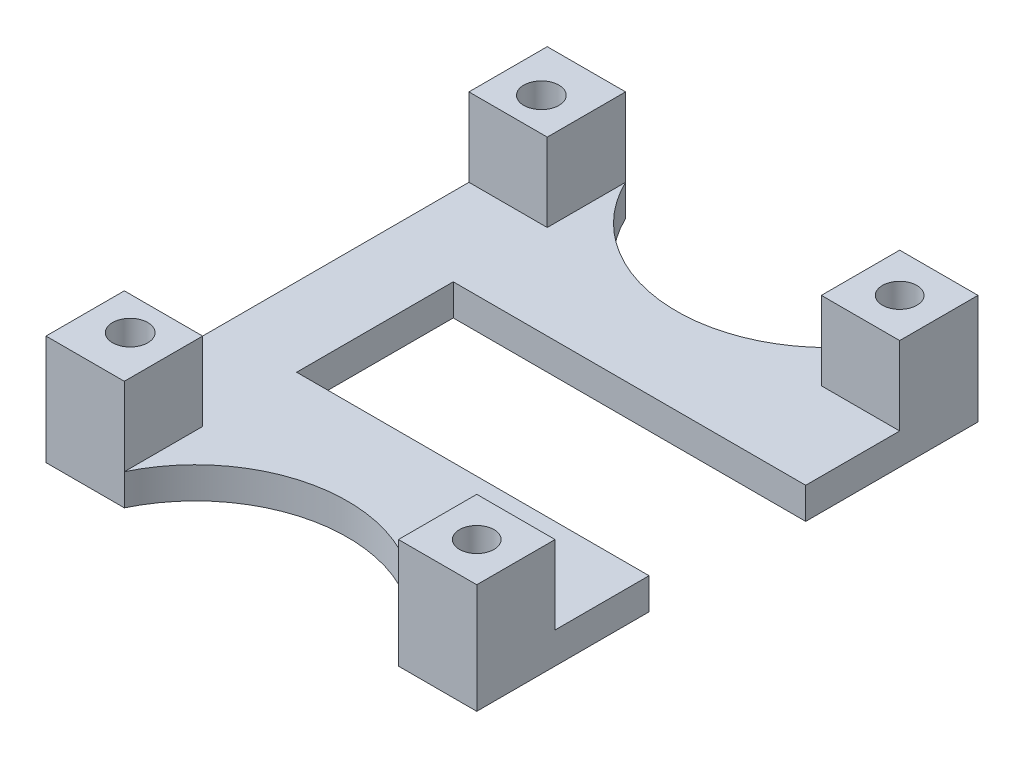
ISO-10303-21;
HEADER;
FILE_DESCRIPTION(('STEP AP214'),'2;1');
FILE_NAME('part.step','',(''),(''),'','','');
FILE_SCHEMA(('AUTOMOTIVE_DESIGN { 1 0 10303 214 1 1 1 1 }'));
ENDSEC;
DATA;
#1=APPLICATION_CONTEXT('core data for automotive mechanical design processes');
#2=APPLICATION_PROTOCOL_DEFINITION('international standard','automotive_design',2000,#1);
#3=PRODUCT_CONTEXT('',#1,'mechanical');
#4=PRODUCT('Part','Part','',(#3));
#5=PRODUCT_RELATED_PRODUCT_CATEGORY('part','',(#4));
#6=PRODUCT_DEFINITION_FORMATION('','',#4);
#7=PRODUCT_DEFINITION_CONTEXT('part definition',#1,'design');
#8=PRODUCT_DEFINITION('design','',#6,#7);
#9=PRODUCT_DEFINITION_SHAPE('','',#8);
#10=(LENGTH_UNIT() NAMED_UNIT(*) SI_UNIT(.MILLI.,.METRE.));
#11=(NAMED_UNIT(*) PLANE_ANGLE_UNIT() SI_UNIT($,.RADIAN.));
#12=(NAMED_UNIT(*) SI_UNIT($,.STERADIAN.) SOLID_ANGLE_UNIT());
#13=UNCERTAINTY_MEASURE_WITH_UNIT(LENGTH_MEASURE(1.E-05),#10,'distance_accuracy_value','');
#14=(GEOMETRIC_REPRESENTATION_CONTEXT(3) GLOBAL_UNCERTAINTY_ASSIGNED_CONTEXT((#13)) GLOBAL_UNIT_ASSIGNED_CONTEXT((#10,
#11,#12)) REPRESENTATION_CONTEXT('',''));
#15=CARTESIAN_POINT('',(0.,0.,0.));
#16=DIRECTION('',(0.,0.,1.));
#17=DIRECTION('',(1.,0.,0.));
#18=AXIS2_PLACEMENT_3D('',#15,#16,#17);
#19=CARTESIAN_POINT('',(50.,4.,-27.));
#20=DIRECTION('',(0.,-1.,0.));
#21=DIRECTION('',(0.,0.,-1.));
#22=AXIS2_PLACEMENT_3D('',#19,#20,#21);
#23=CYLINDRICAL_SURFACE('',#22,2.2);
#24=CARTESIAN_POINT('',(50.,14.,-27.));
#25=DIRECTION('',(0.,1.,0.));
#26=DIRECTION('',(0.,0.,1.));
#27=AXIS2_PLACEMENT_3D('',#24,#25,#26);
#28=CIRCLE('',#27,2.20000000000001);
#29=CARTESIAN_POINT('',(50.,14.,-24.8));
#30=VERTEX_POINT('',#29);
#31=EDGE_CURVE('E381',#30,#30,#28,.T.);
#32=ORIENTED_EDGE('',*,*,#31,.T.);
#33=EDGE_LOOP('',(#32));
#34=FACE_BOUND('',#33,.T.);
#35=CARTESIAN_POINT('',(50.,2.5,-27.));
#36=DIRECTION('',(0.,-1.,0.));
#37=DIRECTION('',(0.,0.,-1.));
#38=AXIS2_PLACEMENT_3D('',#35,#36,#37);
#39=CIRCLE('',#38,2.2);
#40=CARTESIAN_POINT('',(50.,2.5,-29.2));
#41=VERTEX_POINT('',#40);
#42=EDGE_CURVE('E39',#41,#41,#39,.T.);
#43=ORIENTED_EDGE('',*,*,#42,.T.);
#44=EDGE_LOOP('',(#43));
#45=FACE_BOUND('',#44,.T.);
#46=ADVANCED_FACE('F35',(#34,#45),#23,.F.);
#47=CARTESIAN_POINT('',(50.,4.,27.));
#48=DIRECTION('',(0.,-1.,0.));
#49=DIRECTION('',(0.,0.,-1.));
#50=AXIS2_PLACEMENT_3D('',#47,#48,#49);
#51=CYLINDRICAL_SURFACE('',#50,2.2);
#52=CARTESIAN_POINT('',(50.,14.,27.));
#53=DIRECTION('',(0.,1.,0.));
#54=DIRECTION('',(0.,0.,1.));
#55=AXIS2_PLACEMENT_3D('',#52,#53,#54);
#56=CIRCLE('',#55,2.2);
#57=CARTESIAN_POINT('',(50.,14.,29.2));
#58=VERTEX_POINT('',#57);
#59=EDGE_CURVE('E269',#58,#58,#56,.T.);
#60=ORIENTED_EDGE('',*,*,#59,.T.);
#61=EDGE_LOOP('',(#60));
#62=FACE_BOUND('',#61,.T.);
#63=CARTESIAN_POINT('',(50.,2.5,27.));
#64=DIRECTION('',(0.,-1.,0.));
#65=DIRECTION('',(0.,0.,-1.));
#66=AXIS2_PLACEMENT_3D('',#63,#64,#65);
#67=CIRCLE('',#66,2.2);
#68=CARTESIAN_POINT('',(50.,2.5,24.8));
#69=VERTEX_POINT('',#68);
#70=EDGE_CURVE('E375',#69,#69,#67,.T.);
#71=ORIENTED_EDGE('',*,*,#70,.T.);
#72=EDGE_LOOP('',(#71));
#73=FACE_BOUND('',#72,.T.);
#74=ADVANCED_FACE('F491',(#62,#73),#51,.F.);
#75=CARTESIAN_POINT('',(0.,4.,0.));
#76=DIRECTION('',(0.,1.,0.));
#77=DIRECTION('',(0.,0.,1.));
#78=AXIS2_PLACEMENT_3D('',#75,#76,#77);
#79=PLANE('',#78);
#80=DIRECTION('',(0.,0.,-1.));
#81=VECTOR('',#80,1.);
#82=CARTESIAN_POINT('',(55.,4.,0.));
#83=LINE('',#82,#81);
#84=CARTESIAN_POINT('',(55.,4.,-10.));
#85=VERTEX_POINT('',#84);
#86=CARTESIAN_POINT('',(55.,4.,-22.));
#87=VERTEX_POINT('',#86);
#88=EDGE_CURVE('E57',#85,#87,#83,.T.);
#89=ORIENTED_EDGE('',*,*,#88,.T.);
#90=DIRECTION('',(1.,0.,0.));
#91=VECTOR('',#90,1.);
#92=CARTESIAN_POINT('',(45.,4.,-22.));
#93=LINE('',#92,#91);
#94=CARTESIAN_POINT('',(45.,4.,-22.));
#95=VERTEX_POINT('',#94);
#96=EDGE_CURVE('E52',#95,#87,#93,.T.);
#97=ORIENTED_EDGE('',*,*,#96,.F.);
#98=DIRECTION('',(0.,0.,1.));
#99=VECTOR('',#98,1.);
#100=CARTESIAN_POINT('',(45.,4.,-32.));
#101=LINE('',#100,#99);
#102=CARTESIAN_POINT('',(45.,4.,-32.));
#103=VERTEX_POINT('',#102);
#104=EDGE_CURVE('E205',#103,#95,#101,.T.);
#105=ORIENTED_EDGE('',*,*,#104,.F.);
#106=CARTESIAN_POINT('',(27.5,4.,-40.4204545454546));
#107=DIRECTION('',(0.,1.,0.));
#108=DIRECTION('',(0.,0.,1.));
#109=AXIS2_PLACEMENT_3D('',#106,#107,#108);
#110=CIRCLE('',#109,19.4204545454546);
#111=CARTESIAN_POINT('',(10.,4.,-32.));
#112=VERTEX_POINT('',#111);
#113=EDGE_CURVE('E315',#112,#103,#110,.T.);
#114=ORIENTED_EDGE('',*,*,#113,.F.);
#115=DIRECTION('',(0.,0.,-1.));
#116=VECTOR('',#115,1.);
#117=CARTESIAN_POINT('',(10.,4.,-22.));
#118=LINE('',#117,#116);
#119=CARTESIAN_POINT('',(10.,4.,-22.));
#120=VERTEX_POINT('',#119);
#121=EDGE_CURVE('E251',#120,#112,#118,.T.);
#122=ORIENTED_EDGE('',*,*,#121,.F.);
#123=DIRECTION('',(1.,0.,0.));
#124=VECTOR('',#123,1.);
#125=CARTESIAN_POINT('',(0.,4.,-22.));
#126=LINE('',#125,#124);
#127=CARTESIAN_POINT('',(0.,4.,-22.));
#128=VERTEX_POINT('',#127);
#129=EDGE_CURVE('E246',#128,#120,#126,.T.);
#130=ORIENTED_EDGE('',*,*,#129,.F.);
#131=DIRECTION('',(0.,0.,-1.));
#132=VECTOR('',#131,1.);
#133=CARTESIAN_POINT('',(0.,4.,0.));
#134=LINE('',#133,#132);
#135=CARTESIAN_POINT('',(0.,4.,22.));
#136=VERTEX_POINT('',#135);
#137=EDGE_CURVE('E298',#136,#128,#134,.T.);
#138=ORIENTED_EDGE('',*,*,#137,.F.);
#139=DIRECTION('',(-1.,0.,0.));
#140=VECTOR('',#139,1.);
#141=CARTESIAN_POINT('',(10.,4.,22.));
#142=LINE('',#141,#140);
#143=CARTESIAN_POINT('',(10.,4.,22.));
#144=VERTEX_POINT('',#143);
#145=EDGE_CURVE('E223',#144,#136,#142,.T.);
#146=ORIENTED_EDGE('',*,*,#145,.F.);
#147=DIRECTION('',(0.,0.,-1.));
#148=VECTOR('',#147,1.);
#149=CARTESIAN_POINT('',(10.,4.,32.));
#150=LINE('',#149,#148);
#151=CARTESIAN_POINT('',(10.,4.,32.));
#152=VERTEX_POINT('',#151);
#153=EDGE_CURVE('E212',#152,#144,#150,.T.);
#154=ORIENTED_EDGE('',*,*,#153,.F.);
#155=CARTESIAN_POINT('',(27.5,4.,40.4204545454545));
#156=DIRECTION('',(0.,1.,0.));
#157=DIRECTION('',(0.,0.,1.));
#158=AXIS2_PLACEMENT_3D('',#155,#156,#157);
#159=CIRCLE('',#158,19.4204545454545);
#160=CARTESIAN_POINT('',(45.,4.,32.));
#161=VERTEX_POINT('',#160);
#162=EDGE_CURVE('E300',#161,#152,#159,.T.);
#163=ORIENTED_EDGE('',*,*,#162,.F.);
#164=DIRECTION('',(0.,0.,1.));
#165=VECTOR('',#164,1.);
#166=CARTESIAN_POINT('',(45.,4.,32.));
#167=LINE('',#166,#165);
#168=CARTESIAN_POINT('',(45.,4.,22.));
#169=VERTEX_POINT('',#168);
#170=EDGE_CURVE('E272',#169,#161,#167,.T.);
#171=ORIENTED_EDGE('',*,*,#170,.F.);
#172=DIRECTION('',(-1.,0.,0.));
#173=VECTOR('',#172,1.);
#174=CARTESIAN_POINT('',(45.,4.,22.));
#175=LINE('',#174,#173);
#176=CARTESIAN_POINT('',(55.,4.,22.));
#177=VERTEX_POINT('',#176);
#178=EDGE_CURVE('E277',#177,#169,#175,.T.);
#179=ORIENTED_EDGE('',*,*,#178,.F.);
#180=DIRECTION('',(0.,0.,-1.));
#181=VECTOR('',#180,1.);
#182=CARTESIAN_POINT('',(55.,4.,0.));
#183=LINE('',#182,#181);
#184=CARTESIAN_POINT('',(55.,4.,10.));
#185=VERTEX_POINT('',#184);
#186=EDGE_CURVE('E303',#177,#185,#183,.T.);
#187=ORIENTED_EDGE('',*,*,#186,.T.);
#188=DIRECTION('',(1.,0.,0.));
#189=VECTOR('',#188,1.);
#190=CARTESIAN_POINT('',(0.,4.,9.99999999999994));
#191=LINE('',#190,#189);
#192=CARTESIAN_POINT('',(10.,4.,10.));
#193=VERTEX_POINT('',#192);
#194=EDGE_CURVE('E305',#193,#185,#191,.T.);
#195=ORIENTED_EDGE('',*,*,#194,.F.);
#196=DIRECTION('',(0.,0.,1.));
#197=VECTOR('',#196,1.);
#198=CARTESIAN_POINT('',(10.,4.,0.));
#199=LINE('',#198,#197);
#200=CARTESIAN_POINT('',(10.,4.,-9.99999999999999));
#201=VERTEX_POINT('',#200);
#202=EDGE_CURVE('E308',#201,#193,#199,.T.);
#203=ORIENTED_EDGE('',*,*,#202,.F.);
#204=DIRECTION('',(-1.,0.,0.));
#205=VECTOR('',#204,1.);
#206=CARTESIAN_POINT('',(0.,4.,-9.99999999999999));
#207=LINE('',#206,#205);
#208=EDGE_CURVE('E311',#85,#201,#207,.T.);
#209=ORIENTED_EDGE('',*,*,#208,.F.);
#210=EDGE_LOOP('',(#89,#97,#105,#114,#122,#130,#138,#146,#154,#163,#171,#179,#187,#195,#203,#209));
#211=FACE_BOUND('',#210,.T.);
#212=ADVANCED_FACE('F405',(#211),#79,.T.);
#213=CARTESIAN_POINT('',(0.,4.,0.));
#214=DIRECTION('',(-1.,0.,0.));
#215=DIRECTION('',(0.,0.,1.));
#216=AXIS2_PLACEMENT_3D('',#213,#214,#215);
#217=PLANE('',#216);
#218=DIRECTION('',(0.,0.,-1.));
#219=VECTOR('',#218,1.);
#220=CARTESIAN_POINT('',(0.,0.,0.));
#221=LINE('',#220,#219);
#222=CARTESIAN_POINT('',(0.,0.,32.));
#223=VERTEX_POINT('',#222);
#224=CARTESIAN_POINT('',(0.,0.,-32.));
#225=VERTEX_POINT('',#224);
#226=EDGE_CURVE('E297',#223,#225,#221,.T.);
#227=ORIENTED_EDGE('',*,*,#226,.F.);
#228=DIRECTION('',(0.,-1.,0.));
#229=VECTOR('',#228,1.);
#230=CARTESIAN_POINT('',(0.,4.,32.));
#231=LINE('',#230,#229);
#232=CARTESIAN_POINT('',(0.,14.,32.));
#233=VERTEX_POINT('',#232);
#234=EDGE_CURVE('E11',#233,#223,#231,.T.);
#235=ORIENTED_EDGE('',*,*,#234,.F.);
#236=DIRECTION('',(0.,0.,1.));
#237=VECTOR('',#236,1.);
#238=CARTESIAN_POINT('',(0.,14.,22.));
#239=LINE('',#238,#237);
#240=CARTESIAN_POINT('',(0.,14.,22.));
#241=VERTEX_POINT('',#240);
#242=EDGE_CURVE('E225',#241,#233,#239,.T.);
#243=ORIENTED_EDGE('',*,*,#242,.F.);
#244=DIRECTION('',(0.,-1.,0.));
#245=VECTOR('',#244,1.);
#246=CARTESIAN_POINT('',(0.,14.,22.));
#247=LINE('',#246,#245);
#248=EDGE_CURVE('E237',#241,#136,#247,.T.);
#249=ORIENTED_EDGE('',*,*,#248,.T.);
#250=ORIENTED_EDGE('',*,*,#137,.T.);
#251=DIRECTION('',(0.,-1.,0.));
#252=VECTOR('',#251,1.);
#253=CARTESIAN_POINT('',(0.,14.,-22.));
#254=LINE('',#253,#252);
#255=CARTESIAN_POINT('',(0.,14.,-22.));
#256=VERTEX_POINT('',#255);
#257=EDGE_CURVE('E258',#256,#128,#254,.T.);
#258=ORIENTED_EDGE('',*,*,#257,.F.);
#259=DIRECTION('',(0.,0.,1.));
#260=VECTOR('',#259,1.);
#261=CARTESIAN_POINT('',(0.,14.,-32.));
#262=LINE('',#261,#260);
#263=CARTESIAN_POINT('',(0.,14.,-32.));
#264=VERTEX_POINT('',#263);
#265=EDGE_CURVE('E256',#264,#256,#262,.T.);
#266=ORIENTED_EDGE('',*,*,#265,.F.);
#267=DIRECTION('',(0.,-1.,0.));
#268=VECTOR('',#267,1.);
#269=CARTESIAN_POINT('',(0.,4.,-32.));
#270=LINE('',#269,#268);
#271=EDGE_CURVE('E317',#264,#225,#270,.T.);
#272=ORIENTED_EDGE('',*,*,#271,.T.);
#273=EDGE_LOOP('',(#227,#235,#243,#249,#250,#258,#266,#272));
#274=FACE_BOUND('',#273,.T.);
#275=ADVANCED_FACE('F37',(#274),#217,.T.);
#276=CARTESIAN_POINT('',(0.,4.,32.));
#277=DIRECTION('',(0.,0.,-1.));
#278=DIRECTION('',(-1.,0.,0.));
#279=AXIS2_PLACEMENT_3D('',#276,#277,#278);
#280=PLANE('',#279);
#281=DIRECTION('',(1.,0.,0.));
#282=VECTOR('',#281,1.);
#283=CARTESIAN_POINT('',(0.,0.,32.));
#284=LINE('',#283,#282);
#285=CARTESIAN_POINT('',(10.,0.,32.));
#286=VERTEX_POINT('',#285);
#287=EDGE_CURVE('E320',#223,#286,#284,.T.);
#288=ORIENTED_EDGE('',*,*,#287,.T.);
#289=DIRECTION('',(0.,-1.,0.));
#290=VECTOR('',#289,1.);
#291=CARTESIAN_POINT('',(10.,4.,32.));
#292=LINE('',#291,#290);
#293=EDGE_CURVE('E44',#152,#286,#292,.T.);
#294=ORIENTED_EDGE('',*,*,#293,.F.);
#295=DIRECTION('',(0.,-1.,0.));
#296=VECTOR('',#295,1.);
#297=CARTESIAN_POINT('',(10.,14.,32.));
#298=LINE('',#297,#296);
#299=CARTESIAN_POINT('',(10.,14.,32.));
#300=VERTEX_POINT('',#299);
#301=EDGE_CURVE('E230',#300,#152,#298,.T.);
#302=ORIENTED_EDGE('',*,*,#301,.F.);
#303=DIRECTION('',(1.,0.,0.));
#304=VECTOR('',#303,1.);
#305=CARTESIAN_POINT('',(0.,14.,32.));
#306=LINE('',#305,#304);
#307=EDGE_CURVE('E228',#233,#300,#306,.T.);
#308=ORIENTED_EDGE('',*,*,#307,.F.);
#309=ORIENTED_EDGE('',*,*,#234,.T.);
#310=EDGE_LOOP('',(#288,#294,#302,#308,#309));
#311=FACE_BOUND('',#310,.T.);
#312=ADVANCED_FACE('F447',(#311),#280,.F.);
#313=CARTESIAN_POINT('',(27.5,4.,40.4204545454545));
#314=DIRECTION('',(0.,-1.,0.));
#315=DIRECTION('',(0.,0.,-1.));
#316=AXIS2_PLACEMENT_3D('',#313,#314,#315);
#317=CYLINDRICAL_SURFACE('',#316,19.4204545454545);
#318=CARTESIAN_POINT('',(27.5,0.,40.4204545454545));
#319=DIRECTION('',(0.,1.,0.));
#320=DIRECTION('',(0.,0.,1.));
#321=AXIS2_PLACEMENT_3D('',#318,#319,#320);
#322=CIRCLE('',#321,19.4204545454545);
#323=CARTESIAN_POINT('',(45.,0.,32.));
#324=VERTEX_POINT('',#323);
#325=EDGE_CURVE('E323',#324,#286,#322,.T.);
#326=ORIENTED_EDGE('',*,*,#325,.F.);
#327=DIRECTION('',(0.,-1.,0.));
#328=VECTOR('',#327,1.);
#329=CARTESIAN_POINT('',(45.,4.,32.));
#330=LINE('',#329,#328);
#331=EDGE_CURVE('E373',#161,#324,#330,.T.);
#332=ORIENTED_EDGE('',*,*,#331,.F.);
#333=ORIENTED_EDGE('',*,*,#162,.T.);
#334=ORIENTED_EDGE('',*,*,#293,.T.);
#335=EDGE_LOOP('',(#326,#332,#333,#334));
#336=FACE_BOUND('',#335,.T.);
#337=ADVANCED_FACE('F529',(#336),#317,.F.);
#338=CARTESIAN_POINT('',(0.,4.,32.));
#339=DIRECTION('',(0.,0.,1.));
#340=DIRECTION('',(1.,0.,0.));
#341=AXIS2_PLACEMENT_3D('',#338,#339,#340);
#342=PLANE('',#341);
#343=DIRECTION('',(-1.,0.,0.));
#344=VECTOR('',#343,1.);
#345=CARTESIAN_POINT('',(0.,0.,32.));
#346=LINE('',#345,#344);
#347=CARTESIAN_POINT('',(55.,0.,32.));
#348=VERTEX_POINT('',#347);
#349=EDGE_CURVE('E326',#348,#324,#346,.T.);
#350=ORIENTED_EDGE('',*,*,#349,.F.);
#351=DIRECTION('',(0.,-1.,0.));
#352=VECTOR('',#351,1.);
#353=CARTESIAN_POINT('',(55.,4.,32.));
#354=LINE('',#353,#352);
#355=CARTESIAN_POINT('',(55.,14.,32.));
#356=VERTEX_POINT('',#355);
#357=EDGE_CURVE('E371',#356,#348,#354,.T.);
#358=ORIENTED_EDGE('',*,*,#357,.F.);
#359=DIRECTION('',(1.,0.,0.));
#360=VECTOR('',#359,1.);
#361=CARTESIAN_POINT('',(55.,14.,32.));
#362=LINE('',#361,#360);
#363=CARTESIAN_POINT('',(45.,14.,32.));
#364=VERTEX_POINT('',#363);
#365=EDGE_CURVE('E276',#364,#356,#362,.T.);
#366=ORIENTED_EDGE('',*,*,#365,.F.);
#367=DIRECTION('',(0.,-1.,0.));
#368=VECTOR('',#367,1.);
#369=CARTESIAN_POINT('',(45.,14.,32.));
#370=LINE('',#369,#368);
#371=EDGE_CURVE('E294',#364,#161,#370,.T.);
#372=ORIENTED_EDGE('',*,*,#371,.T.);
#373=ORIENTED_EDGE('',*,*,#331,.T.);
#374=EDGE_LOOP('',(#350,#358,#366,#372,#373));
#375=FACE_BOUND('',#374,.T.);
#376=ADVANCED_FACE('F457',(#375),#342,.T.);
#377=CARTESIAN_POINT('',(55.,4.,0.));
#378=DIRECTION('',(-1.,0.,0.));
#379=DIRECTION('',(0.,0.,1.));
#380=AXIS2_PLACEMENT_3D('',#377,#378,#379);
#381=PLANE('',#380);
#382=DIRECTION('',(0.,0.,-1.));
#383=VECTOR('',#382,1.);
#384=CARTESIAN_POINT('',(55.,0.,0.));
#385=LINE('',#384,#383);
#386=CARTESIAN_POINT('',(55.,0.,10.));
#387=VERTEX_POINT('',#386);
#388=EDGE_CURVE('E329',#348,#387,#385,.T.);
#389=ORIENTED_EDGE('',*,*,#388,.T.);
#390=DIRECTION('',(0.,-1.,0.));
#391=VECTOR('',#390,1.);
#392=CARTESIAN_POINT('',(55.,4.,10.));
#393=LINE('',#392,#391);
#394=EDGE_CURVE('E369',#185,#387,#393,.T.);
#395=ORIENTED_EDGE('',*,*,#394,.F.);
#396=ORIENTED_EDGE('',*,*,#186,.F.);
#397=DIRECTION('',(0.,-1.,0.));
#398=VECTOR('',#397,1.);
#399=CARTESIAN_POINT('',(55.,14.,22.));
#400=LINE('',#399,#398);
#401=CARTESIAN_POINT('',(55.,14.,22.));
#402=VERTEX_POINT('',#401);
#403=EDGE_CURVE('E291',#402,#177,#400,.T.);
#404=ORIENTED_EDGE('',*,*,#403,.F.);
#405=DIRECTION('',(0.,0.,-1.));
#406=VECTOR('',#405,1.);
#407=CARTESIAN_POINT('',(55.,14.,22.));
#408=LINE('',#407,#406);
#409=EDGE_CURVE('E280',#356,#402,#408,.T.);
#410=ORIENTED_EDGE('',*,*,#409,.F.);
#411=ORIENTED_EDGE('',*,*,#357,.T.);
#412=EDGE_LOOP('',(#389,#395,#396,#404,#410,#411));
#413=FACE_BOUND('',#412,.T.);
#414=ADVANCED_FACE('F471',(#413),#381,.F.);
#415=CARTESIAN_POINT('',(0.,4.,9.99999999999994));
#416=DIRECTION('',(0.,0.,-1.));
#417=DIRECTION('',(-1.,0.,0.));
#418=AXIS2_PLACEMENT_3D('',#415,#416,#417);
#419=PLANE('',#418);
#420=DIRECTION('',(1.,0.,0.));
#421=VECTOR('',#420,1.);
#422=CARTESIAN_POINT('',(0.,0.,9.99999999999994));
#423=LINE('',#422,#421);
#424=CARTESIAN_POINT('',(10.,0.,10.));
#425=VERTEX_POINT('',#424);
#426=EDGE_CURVE('E332',#425,#387,#423,.T.);
#427=ORIENTED_EDGE('',*,*,#426,.F.);
#428=DIRECTION('',(0.,-1.,0.));
#429=VECTOR('',#428,1.);
#430=CARTESIAN_POINT('',(10.,4.,10.));
#431=LINE('',#430,#429);
#432=EDGE_CURVE('E367',#193,#425,#431,.T.);
#433=ORIENTED_EDGE('',*,*,#432,.F.);
#434=ORIENTED_EDGE('',*,*,#194,.T.);
#435=ORIENTED_EDGE('',*,*,#394,.T.);
#436=EDGE_LOOP('',(#427,#433,#434,#435));
#437=FACE_BOUND('',#436,.T.);
#438=ADVANCED_FACE('F476',(#437),#419,.T.);
#439=CARTESIAN_POINT('',(10.,4.,0.));
#440=DIRECTION('',(1.,0.,0.));
#441=DIRECTION('',(0.,0.,-1.));
#442=AXIS2_PLACEMENT_3D('',#439,#440,#441);
#443=PLANE('',#442);
#444=DIRECTION('',(0.,0.,1.));
#445=VECTOR('',#444,1.);
#446=CARTESIAN_POINT('',(10.,0.,0.));
#447=LINE('',#446,#445);
#448=CARTESIAN_POINT('',(10.,0.,-9.99999999999999));
#449=VERTEX_POINT('',#448);
#450=EDGE_CURVE('E335',#449,#425,#447,.T.);
#451=ORIENTED_EDGE('',*,*,#450,.F.);
#452=DIRECTION('',(0.,-1.,0.));
#453=VECTOR('',#452,1.);
#454=CARTESIAN_POINT('',(10.,4.,-9.99999999999999));
#455=LINE('',#454,#453);
#456=EDGE_CURVE('E365',#201,#449,#455,.T.);
#457=ORIENTED_EDGE('',*,*,#456,.F.);
#458=ORIENTED_EDGE('',*,*,#202,.T.);
#459=ORIENTED_EDGE('',*,*,#432,.T.);
#460=EDGE_LOOP('',(#451,#457,#458,#459));
#461=FACE_BOUND('',#460,.T.);
#462=ADVANCED_FACE('F480',(#461),#443,.T.);
#463=CARTESIAN_POINT('',(0.,4.,-9.99999999999999));
#464=DIRECTION('',(0.,0.,1.));
#465=DIRECTION('',(1.,0.,0.));
#466=AXIS2_PLACEMENT_3D('',#463,#464,#465);
#467=PLANE('',#466);
#468=DIRECTION('',(-1.,0.,0.));
#469=VECTOR('',#468,1.);
#470=CARTESIAN_POINT('',(0.,0.,-9.99999999999999));
#471=LINE('',#470,#469);
#472=CARTESIAN_POINT('',(55.,0.,-10.));
#473=VERTEX_POINT('',#472);
#474=EDGE_CURVE('E338',#473,#449,#471,.T.);
#475=ORIENTED_EDGE('',*,*,#474,.F.);
#476=DIRECTION('',(0.,-1.,0.));
#477=VECTOR('',#476,1.);
#478=CARTESIAN_POINT('',(55.,4.,-10.));
#479=LINE('',#478,#477);
#480=EDGE_CURVE('E363',#85,#473,#479,.T.);
#481=ORIENTED_EDGE('',*,*,#480,.F.);
#482=ORIENTED_EDGE('',*,*,#208,.T.);
#483=ORIENTED_EDGE('',*,*,#456,.T.);
#484=EDGE_LOOP('',(#475,#481,#482,#483));
#485=FACE_BOUND('',#484,.T.);
#486=ADVANCED_FACE('F483',(#485),#467,.T.);
#487=CARTESIAN_POINT('',(55.,4.,0.));
#488=DIRECTION('',(-1.,0.,0.));
#489=DIRECTION('',(0.,0.,1.));
#490=AXIS2_PLACEMENT_3D('',#487,#488,#489);
#491=PLANE('',#490);
#492=DIRECTION('',(0.,0.,-1.));
#493=VECTOR('',#492,1.);
#494=CARTESIAN_POINT('',(55.,0.,0.));
#495=LINE('',#494,#493);
#496=CARTESIAN_POINT('',(55.,0.,-32.));
#497=VERTEX_POINT('',#496);
#498=EDGE_CURVE('E341',#473,#497,#495,.T.);
#499=ORIENTED_EDGE('',*,*,#498,.T.);
#500=DIRECTION('',(0.,-1.,0.));
#501=VECTOR('',#500,1.);
#502=CARTESIAN_POINT('',(55.,4.,-32.));
#503=LINE('',#502,#501);
#504=CARTESIAN_POINT('',(55.,14.,-32.));
#505=VERTEX_POINT('',#504);
#506=EDGE_CURVE('E191',#505,#497,#503,.T.);
#507=ORIENTED_EDGE('',*,*,#506,.F.);
#508=DIRECTION('',(0.,0.,-1.));
#509=VECTOR('',#508,1.);
#510=CARTESIAN_POINT('',(55.,14.,-22.));
#511=LINE('',#510,#509);
#512=CARTESIAN_POINT('',(55.,14.,-22.));
#513=VERTEX_POINT('',#512);
#514=EDGE_CURVE('E185',#513,#505,#511,.T.);
#515=ORIENTED_EDGE('',*,*,#514,.F.);
#516=DIRECTION('',(0.,-1.,0.));
#517=VECTOR('',#516,1.);
#518=CARTESIAN_POINT('',(55.,14.,-22.));
#519=LINE('',#518,#517);
#520=EDGE_CURVE('E189',#513,#87,#519,.T.);
#521=ORIENTED_EDGE('',*,*,#520,.T.);
#522=ORIENTED_EDGE('',*,*,#88,.F.);
#523=ORIENTED_EDGE('',*,*,#480,.T.);
#524=EDGE_LOOP('',(#499,#507,#515,#521,#522,#523));
#525=FACE_BOUND('',#524,.T.);
#526=ADVANCED_FACE('F187',(#525),#491,.F.);
#527=CARTESIAN_POINT('',(0.,4.,-32.));
#528=DIRECTION('',(0.,0.,1.));
#529=DIRECTION('',(1.,0.,0.));
#530=AXIS2_PLACEMENT_3D('',#527,#528,#529);
#531=PLANE('',#530);
#532=DIRECTION('',(-1.,0.,0.));
#533=VECTOR('',#532,1.);
#534=CARTESIAN_POINT('',(0.,0.,-32.));
#535=LINE('',#534,#533);
#536=CARTESIAN_POINT('',(45.,0.,-32.));
#537=VERTEX_POINT('',#536);
#538=EDGE_CURVE('E343',#497,#537,#535,.T.);
#539=ORIENTED_EDGE('',*,*,#538,.T.);
#540=DIRECTION('',(0.,-1.,0.));
#541=VECTOR('',#540,1.);
#542=CARTESIAN_POINT('',(45.,4.,-32.));
#543=LINE('',#542,#541);
#544=EDGE_CURVE('E360',#103,#537,#543,.T.);
#545=ORIENTED_EDGE('',*,*,#544,.F.);
#546=DIRECTION('',(0.,-1.,0.));
#547=VECTOR('',#546,1.);
#548=CARTESIAN_POINT('',(45.,14.,-32.));
#549=LINE('',#548,#547);
#550=CARTESIAN_POINT('',(45.,14.,-32.));
#551=VERTEX_POINT('',#550);
#552=EDGE_CURVE('E209',#551,#103,#549,.T.);
#553=ORIENTED_EDGE('',*,*,#552,.F.);
#554=DIRECTION('',(-1.,0.,0.));
#555=VECTOR('',#554,1.);
#556=CARTESIAN_POINT('',(55.,14.,-32.));
#557=LINE('',#556,#555);
#558=EDGE_CURVE('E194',#505,#551,#557,.T.);
#559=ORIENTED_EDGE('',*,*,#558,.F.);
#560=ORIENTED_EDGE('',*,*,#506,.T.);
#561=EDGE_LOOP('',(#539,#545,#553,#559,#560));
#562=FACE_BOUND('',#561,.T.);
#563=ADVANCED_FACE('F414',(#562),#531,.F.);
#564=CARTESIAN_POINT('',(27.5,4.,-40.4204545454546));
#565=DIRECTION('',(0.,-1.,0.));
#566=DIRECTION('',(0.,0.,-1.));
#567=AXIS2_PLACEMENT_3D('',#564,#565,#566);
#568=CYLINDRICAL_SURFACE('',#567,19.4204545454546);
#569=CARTESIAN_POINT('',(27.5,0.,-40.4204545454546));
#570=DIRECTION('',(0.,1.,0.));
#571=DIRECTION('',(0.,0.,1.));
#572=AXIS2_PLACEMENT_3D('',#569,#570,#571);
#573=CIRCLE('',#572,19.4204545454546);
#574=CARTESIAN_POINT('',(10.,0.,-32.));
#575=VERTEX_POINT('',#574);
#576=EDGE_CURVE('E346',#575,#537,#573,.T.);
#577=ORIENTED_EDGE('',*,*,#576,.F.);
#578=DIRECTION('',(0.,-1.,0.));
#579=VECTOR('',#578,1.);
#580=CARTESIAN_POINT('',(10.,4.,-32.));
#581=LINE('',#580,#579);
#582=EDGE_CURVE('E358',#112,#575,#581,.T.);
#583=ORIENTED_EDGE('',*,*,#582,.F.);
#584=ORIENTED_EDGE('',*,*,#113,.T.);
#585=ORIENTED_EDGE('',*,*,#544,.T.);
#586=EDGE_LOOP('',(#577,#583,#584,#585));
#587=FACE_BOUND('',#586,.T.);
#588=ADVANCED_FACE('F412',(#587),#568,.F.);
#589=CARTESIAN_POINT('',(4.99999999999938,4.,26.2500000000027));
#590=DIRECTION('',(0.,-1.,0.));
#591=DIRECTION('',(0.,0.,-1.));
#592=AXIS2_PLACEMENT_3D('',#589,#590,#591);
#593=CYLINDRICAL_SURFACE('',#592,2.24790000000131);
#594=CARTESIAN_POINT('',(4.99999999999938,0.,26.2500000000027));
#595=DIRECTION('',(0.,1.,0.));
#596=DIRECTION('',(0.,0.,1.));
#597=AXIS2_PLACEMENT_3D('',#594,#595,#596);
#598=CIRCLE('',#597,2.24790000000131);
#599=CARTESIAN_POINT('',(4.99999999999938,0.,28.497900000004));
#600=VERTEX_POINT('',#599);
#601=EDGE_CURVE('E301',#600,#600,#598,.T.);
#602=ORIENTED_EDGE('',*,*,#601,.F.);
#603=EDGE_LOOP('',(#602));
#604=FACE_BOUND('',#603,.T.);
#605=CARTESIAN_POINT('',(4.99999999999938,14.,26.2500000000027));
#606=DIRECTION('',(0.,1.,0.));
#607=DIRECTION('',(0.,0.,1.));
#608=AXIS2_PLACEMENT_3D('',#605,#606,#607);
#609=CIRCLE('',#608,2.24790000000131);
#610=CARTESIAN_POINT('',(4.99999999999938,14.,28.497900000004));
#611=VERTEX_POINT('',#610);
#612=EDGE_CURVE('E208',#611,#611,#609,.T.);
#613=ORIENTED_EDGE('',*,*,#612,.T.);
#614=EDGE_LOOP('',(#613));
#615=FACE_BOUND('',#614,.T.);
#616=ADVANCED_FACE('F503',(#604,#615),#593,.F.);
#617=CARTESIAN_POINT('',(4.99999999999945,4.,-26.2499999999973));
#618=DIRECTION('',(0.,-1.,0.));
#619=DIRECTION('',(0.,0.,-1.));
#620=AXIS2_PLACEMENT_3D('',#617,#618,#619);
#621=CYLINDRICAL_SURFACE('',#620,2.24790000000131);
#622=CARTESIAN_POINT('',(4.99999999999945,0.,-26.2499999999973));
#623=DIRECTION('',(0.,1.,0.));
#624=DIRECTION('',(0.,0.,1.));
#625=AXIS2_PLACEMENT_3D('',#622,#623,#624);
#626=CIRCLE('',#625,2.24790000000131);
#627=CARTESIAN_POINT('',(4.99999999999945,0.,-24.002099999996));
#628=VERTEX_POINT('',#627);
#629=EDGE_CURVE('E352',#628,#628,#626,.T.);
#630=ORIENTED_EDGE('',*,*,#629,.F.);
#631=EDGE_LOOP('',(#630));
#632=FACE_BOUND('',#631,.T.);
#633=CARTESIAN_POINT('',(4.99999999999945,14.,-26.2499999999973));
#634=DIRECTION('',(0.,1.,0.));
#635=DIRECTION('',(0.,0.,1.));
#636=AXIS2_PLACEMENT_3D('',#633,#634,#635);
#637=CIRCLE('',#636,2.24790000000131);
#638=CARTESIAN_POINT('',(4.99999999999945,14.,-24.002099999996));
#639=VERTEX_POINT('',#638);
#640=EDGE_CURVE('E243',#639,#639,#637,.T.);
#641=ORIENTED_EDGE('',*,*,#640,.T.);
#642=EDGE_LOOP('',(#641));
#643=FACE_BOUND('',#642,.T.);
#644=ADVANCED_FACE('F505',(#632,#643),#621,.F.);
#645=CARTESIAN_POINT('',(0.,4.,-32.));
#646=DIRECTION('',(0.,0.,-1.));
#647=DIRECTION('',(-1.,0.,0.));
#648=AXIS2_PLACEMENT_3D('',#645,#646,#647);
#649=PLANE('',#648);
#650=DIRECTION('',(1.,0.,0.));
#651=VECTOR('',#650,1.);
#652=CARTESIAN_POINT('',(0.,0.,-32.));
#653=LINE('',#652,#651);
#654=EDGE_CURVE('E349',#225,#575,#653,.T.);
#655=ORIENTED_EDGE('',*,*,#654,.F.);
#656=ORIENTED_EDGE('',*,*,#271,.F.);
#657=DIRECTION('',(-1.,0.,0.));
#658=VECTOR('',#657,1.);
#659=CARTESIAN_POINT('',(10.,14.,-32.));
#660=LINE('',#659,#658);
#661=CARTESIAN_POINT('',(10.,14.,-32.));
#662=VERTEX_POINT('',#661);
#663=EDGE_CURVE('E253',#662,#264,#660,.T.);
#664=ORIENTED_EDGE('',*,*,#663,.F.);
#665=DIRECTION('',(0.,-1.,0.));
#666=VECTOR('',#665,1.);
#667=CARTESIAN_POINT('',(10.,14.,-32.));
#668=LINE('',#667,#666);
#669=EDGE_CURVE('E264',#662,#112,#668,.T.);
#670=ORIENTED_EDGE('',*,*,#669,.T.);
#671=ORIENTED_EDGE('',*,*,#582,.T.);
#672=EDGE_LOOP('',(#655,#656,#664,#670,#671));
#673=FACE_BOUND('',#672,.T.);
#674=ADVANCED_FACE('F424',(#673),#649,.T.);
#675=CARTESIAN_POINT('',(0.,0.,0.));
#676=DIRECTION('',(0.,1.,0.));
#677=DIRECTION('',(0.,0.,1.));
#678=AXIS2_PLACEMENT_3D('',#675,#676,#677);
#679=PLANE('',#678);
#680=CARTESIAN_POINT('',(50.,0.,27.));
#681=DIRECTION('',(0.,-1.,0.));
#682=DIRECTION('',(0.,0.,-1.));
#683=AXIS2_PLACEMENT_3D('',#680,#681,#682);
#684=CIRCLE('',#683,4.215);
#685=CARTESIAN_POINT('',(50.,0.,22.785));
#686=VERTEX_POINT('',#685);
#687=EDGE_CURVE('E383',#686,#686,#684,.T.);
#688=ORIENTED_EDGE('',*,*,#687,.F.);
#689=EDGE_LOOP('',(#688));
#690=FACE_BOUND('',#689,.T.);
#691=CARTESIAN_POINT('',(50.,0.,-27.));
#692=DIRECTION('',(0.,-1.,0.));
#693=DIRECTION('',(0.,0.,-1.));
#694=AXIS2_PLACEMENT_3D('',#691,#692,#693);
#695=CIRCLE('',#694,4.215);
#696=CARTESIAN_POINT('',(50.,0.,-31.215));
#697=VERTEX_POINT('',#696);
#698=EDGE_CURVE('E393',#697,#697,#695,.T.);
#699=ORIENTED_EDGE('',*,*,#698,.F.);
#700=EDGE_LOOP('',(#699));
#701=FACE_BOUND('',#700,.T.);
#702=ORIENTED_EDGE('',*,*,#226,.T.);
#703=ORIENTED_EDGE('',*,*,#654,.T.);
#704=ORIENTED_EDGE('',*,*,#576,.T.);
#705=ORIENTED_EDGE('',*,*,#538,.F.);
#706=ORIENTED_EDGE('',*,*,#498,.F.);
#707=ORIENTED_EDGE('',*,*,#474,.T.);
#708=ORIENTED_EDGE('',*,*,#450,.T.);
#709=ORIENTED_EDGE('',*,*,#426,.T.);
#710=ORIENTED_EDGE('',*,*,#388,.F.);
#711=ORIENTED_EDGE('',*,*,#349,.T.);
#712=ORIENTED_EDGE('',*,*,#325,.T.);
#713=ORIENTED_EDGE('',*,*,#287,.F.);
#714=EDGE_LOOP('',(#702,#703,#704,#705,#706,#707,#708,#709,#710,#711,#712,#713));
#715=FACE_BOUND('',#714,.T.);
#716=ORIENTED_EDGE('',*,*,#629,.T.);
#717=EDGE_LOOP('',(#716));
#718=FACE_BOUND('',#717,.T.);
#719=ORIENTED_EDGE('',*,*,#601,.T.);
#720=EDGE_LOOP('',(#719));
#721=FACE_BOUND('',#720,.T.);
#722=ADVANCED_FACE('F418',(#690,#701,#715,#718,#721),#679,.F.);
#723=CARTESIAN_POINT('',(0.,14.,0.));
#724=DIRECTION('',(0.,-1.,0.));
#725=DIRECTION('',(0.,0.,-1.));
#726=AXIS2_PLACEMENT_3D('',#723,#724,#725);
#727=PLANE('',#726);
#728=DIRECTION('',(0.,0.,1.));
#729=VECTOR('',#728,1.);
#730=CARTESIAN_POINT('',(45.,14.,32.));
#731=LINE('',#730,#729);
#732=CARTESIAN_POINT('',(45.,14.,22.));
#733=VERTEX_POINT('',#732);
#734=EDGE_CURVE('E273',#733,#364,#731,.T.);
#735=ORIENTED_EDGE('',*,*,#734,.T.);
#736=ORIENTED_EDGE('',*,*,#365,.T.);
#737=ORIENTED_EDGE('',*,*,#409,.T.);
#738=DIRECTION('',(-1.,0.,0.));
#739=VECTOR('',#738,1.);
#740=CARTESIAN_POINT('',(45.,14.,22.));
#741=LINE('',#740,#739);
#742=EDGE_CURVE('E282',#402,#733,#741,.T.);
#743=ORIENTED_EDGE('',*,*,#742,.T.);
#744=EDGE_LOOP('',(#735,#736,#737,#743));
#745=FACE_BOUND('',#744,.T.);
#746=ORIENTED_EDGE('',*,*,#59,.F.);
#747=EDGE_LOOP('',(#746));
#748=FACE_BOUND('',#747,.T.);
#749=ADVANCED_FACE('F485',(#745,#748),#727,.F.);
#750=CARTESIAN_POINT('',(45.,14.,32.));
#751=DIRECTION('',(1.,0.,0.));
#752=DIRECTION('',(0.,0.,-1.));
#753=AXIS2_PLACEMENT_3D('',#750,#751,#752);
#754=PLANE('',#753);
#755=ORIENTED_EDGE('',*,*,#170,.T.);
#756=ORIENTED_EDGE('',*,*,#371,.F.);
#757=ORIENTED_EDGE('',*,*,#734,.F.);
#758=DIRECTION('',(0.,-1.,0.));
#759=VECTOR('',#758,1.);
#760=CARTESIAN_POINT('',(45.,14.,22.));
#761=LINE('',#760,#759);
#762=EDGE_CURVE('E284',#733,#169,#761,.T.);
#763=ORIENTED_EDGE('',*,*,#762,.T.);
#764=EDGE_LOOP('',(#755,#756,#757,#763));
#765=FACE_BOUND('',#764,.T.);
#766=ADVANCED_FACE('F461',(#765),#754,.F.);
#767=CARTESIAN_POINT('',(45.,14.,22.));
#768=DIRECTION('',(0.,0.,1.));
#769=DIRECTION('',(1.,0.,0.));
#770=AXIS2_PLACEMENT_3D('',#767,#768,#769);
#771=PLANE('',#770);
#772=ORIENTED_EDGE('',*,*,#178,.T.);
#773=ORIENTED_EDGE('',*,*,#762,.F.);
#774=ORIENTED_EDGE('',*,*,#742,.F.);
#775=ORIENTED_EDGE('',*,*,#403,.T.);
#776=EDGE_LOOP('',(#772,#773,#774,#775));
#777=FACE_BOUND('',#776,.T.);
#778=ADVANCED_FACE('F465',(#777),#771,.F.);
#779=CARTESIAN_POINT('',(0.,14.,0.));
#780=DIRECTION('',(0.,1.,0.));
#781=DIRECTION('',(0.,0.,1.));
#782=AXIS2_PLACEMENT_3D('',#779,#780,#781);
#783=PLANE('',#782);
#784=DIRECTION('',(1.,0.,0.));
#785=VECTOR('',#784,1.);
#786=CARTESIAN_POINT('',(0.,14.,-22.));
#787=LINE('',#786,#785);
#788=CARTESIAN_POINT('',(10.,14.,-22.));
#789=VERTEX_POINT('',#788);
#790=EDGE_CURVE('E247',#256,#789,#787,.T.);
#791=ORIENTED_EDGE('',*,*,#790,.T.);
#792=DIRECTION('',(0.,0.,-1.));
#793=VECTOR('',#792,1.);
#794=CARTESIAN_POINT('',(10.,14.,-22.));
#795=LINE('',#794,#793);
#796=EDGE_CURVE('E250',#789,#662,#795,.T.);
#797=ORIENTED_EDGE('',*,*,#796,.T.);
#798=ORIENTED_EDGE('',*,*,#663,.T.);
#799=ORIENTED_EDGE('',*,*,#265,.T.);
#800=EDGE_LOOP('',(#791,#797,#798,#799));
#801=FACE_BOUND('',#800,.T.);
#802=ORIENTED_EDGE('',*,*,#640,.F.);
#803=EDGE_LOOP('',(#802));
#804=FACE_BOUND('',#803,.T.);
#805=ADVANCED_FACE('F664',(#801,#804),#783,.T.);
#806=CARTESIAN_POINT('',(0.,14.,-22.));
#807=DIRECTION('',(0.,0.,-1.));
#808=DIRECTION('',(-1.,0.,0.));
#809=AXIS2_PLACEMENT_3D('',#806,#807,#808);
#810=PLANE('',#809);
#811=ORIENTED_EDGE('',*,*,#129,.T.);
#812=DIRECTION('',(0.,-1.,0.));
#813=VECTOR('',#812,1.);
#814=CARTESIAN_POINT('',(10.,14.,-22.));
#815=LINE('',#814,#813);
#816=EDGE_CURVE('E267',#789,#120,#815,.T.);
#817=ORIENTED_EDGE('',*,*,#816,.F.);
#818=ORIENTED_EDGE('',*,*,#790,.F.);
#819=ORIENTED_EDGE('',*,*,#257,.T.);
#820=EDGE_LOOP('',(#811,#817,#818,#819));
#821=FACE_BOUND('',#820,.T.);
#822=ADVANCED_FACE('F432',(#821),#810,.F.);
#823=CARTESIAN_POINT('',(10.,14.,-22.));
#824=DIRECTION('',(-1.,0.,0.));
#825=DIRECTION('',(0.,0.,1.));
#826=AXIS2_PLACEMENT_3D('',#823,#824,#825);
#827=PLANE('',#826);
#828=ORIENTED_EDGE('',*,*,#121,.T.);
#829=ORIENTED_EDGE('',*,*,#669,.F.);
#830=ORIENTED_EDGE('',*,*,#796,.F.);
#831=ORIENTED_EDGE('',*,*,#816,.T.);
#832=EDGE_LOOP('',(#828,#829,#830,#831));
#833=FACE_BOUND('',#832,.T.);
#834=ADVANCED_FACE('F428',(#833),#827,.F.);
#835=CARTESIAN_POINT('',(0.,14.,0.));
#836=DIRECTION('',(0.,1.,0.));
#837=DIRECTION('',(0.,0.,1.));
#838=AXIS2_PLACEMENT_3D('',#835,#836,#837);
#839=PLANE('',#838);
#840=DIRECTION('',(0.,0.,-1.));
#841=VECTOR('',#840,1.);
#842=CARTESIAN_POINT('',(10.,14.,32.));
#843=LINE('',#842,#841);
#844=CARTESIAN_POINT('',(10.,14.,22.));
#845=VERTEX_POINT('',#844);
#846=EDGE_CURVE('E219',#300,#845,#843,.T.);
#847=ORIENTED_EDGE('',*,*,#846,.T.);
#848=DIRECTION('',(-1.,0.,0.));
#849=VECTOR('',#848,1.);
#850=CARTESIAN_POINT('',(10.,14.,22.));
#851=LINE('',#850,#849);
#852=EDGE_CURVE('E222',#845,#241,#851,.T.);
#853=ORIENTED_EDGE('',*,*,#852,.T.);
#854=ORIENTED_EDGE('',*,*,#242,.T.);
#855=ORIENTED_EDGE('',*,*,#307,.T.);
#856=EDGE_LOOP('',(#847,#853,#854,#855));
#857=FACE_BOUND('',#856,.T.);
#858=ORIENTED_EDGE('',*,*,#612,.F.);
#859=EDGE_LOOP('',(#858));
#860=FACE_BOUND('',#859,.T.);
#861=ADVANCED_FACE('F443',(#857,#860),#839,.T.);
#862=CARTESIAN_POINT('',(10.,14.,32.));
#863=DIRECTION('',(-1.,0.,0.));
#864=DIRECTION('',(0.,0.,1.));
#865=AXIS2_PLACEMENT_3D('',#862,#863,#864);
#866=PLANE('',#865);
#867=ORIENTED_EDGE('',*,*,#153,.T.);
#868=DIRECTION('',(0.,-1.,0.));
#869=VECTOR('',#868,1.);
#870=CARTESIAN_POINT('',(10.,14.,22.));
#871=LINE('',#870,#869);
#872=EDGE_CURVE('E240',#845,#144,#871,.T.);
#873=ORIENTED_EDGE('',*,*,#872,.F.);
#874=ORIENTED_EDGE('',*,*,#846,.F.);
#875=ORIENTED_EDGE('',*,*,#301,.T.);
#876=EDGE_LOOP('',(#867,#873,#874,#875));
#877=FACE_BOUND('',#876,.T.);
#878=ADVANCED_FACE('F451',(#877),#866,.F.);
#879=CARTESIAN_POINT('',(10.,14.,22.));
#880=DIRECTION('',(0.,0.,1.));
#881=DIRECTION('',(1.,0.,0.));
#882=AXIS2_PLACEMENT_3D('',#879,#880,#881);
#883=PLANE('',#882);
#884=ORIENTED_EDGE('',*,*,#145,.T.);
#885=ORIENTED_EDGE('',*,*,#248,.F.);
#886=ORIENTED_EDGE('',*,*,#852,.F.);
#887=ORIENTED_EDGE('',*,*,#872,.T.);
#888=EDGE_LOOP('',(#884,#885,#886,#887));
#889=FACE_BOUND('',#888,.T.);
#890=ADVANCED_FACE('F438',(#889),#883,.F.);
#891=CARTESIAN_POINT('',(0.,14.,0.));
#892=DIRECTION('',(0.,1.,0.));
#893=DIRECTION('',(0.,0.,1.));
#894=AXIS2_PLACEMENT_3D('',#891,#892,#893);
#895=PLANE('',#894);
#896=DIRECTION('',(1.,0.,0.));
#897=VECTOR('',#896,1.);
#898=CARTESIAN_POINT('',(45.,14.,-22.));
#899=LINE('',#898,#897);
#900=CARTESIAN_POINT('',(45.,14.,-22.));
#901=VERTEX_POINT('',#900);
#902=EDGE_CURVE('E195',#901,#513,#899,.T.);
#903=ORIENTED_EDGE('',*,*,#902,.T.);
#904=ORIENTED_EDGE('',*,*,#514,.T.);
#905=ORIENTED_EDGE('',*,*,#558,.T.);
#906=DIRECTION('',(0.,0.,1.));
#907=VECTOR('',#906,1.);
#908=CARTESIAN_POINT('',(45.,14.,-32.));
#909=LINE('',#908,#907);
#910=EDGE_CURVE('E201',#551,#901,#909,.T.);
#911=ORIENTED_EDGE('',*,*,#910,.T.);
#912=EDGE_LOOP('',(#903,#904,#905,#911));
#913=FACE_BOUND('',#912,.T.);
#914=ORIENTED_EDGE('',*,*,#31,.F.);
#915=EDGE_LOOP('',(#914));
#916=FACE_BOUND('',#915,.T.);
#917=ADVANCED_FACE('F198',(#913,#916),#895,.T.);
#918=CARTESIAN_POINT('',(45.,14.,-22.));
#919=DIRECTION('',(0.,0.,-1.));
#920=DIRECTION('',(-1.,0.,0.));
#921=AXIS2_PLACEMENT_3D('',#918,#919,#920);
#922=PLANE('',#921);
#923=ORIENTED_EDGE('',*,*,#96,.T.);
#924=ORIENTED_EDGE('',*,*,#520,.F.);
#925=ORIENTED_EDGE('',*,*,#902,.F.);
#926=DIRECTION('',(0.,-1.,0.));
#927=VECTOR('',#926,1.);
#928=CARTESIAN_POINT('',(45.,14.,-22.));
#929=LINE('',#928,#927);
#930=EDGE_CURVE('E215',#901,#95,#929,.T.);
#931=ORIENTED_EDGE('',*,*,#930,.T.);
#932=EDGE_LOOP('',(#923,#924,#925,#931));
#933=FACE_BOUND('',#932,.T.);
#934=ADVANCED_FACE('F207',(#933),#922,.F.);
#935=CARTESIAN_POINT('',(45.,14.,-32.));
#936=DIRECTION('',(1.,0.,0.));
#937=DIRECTION('',(0.,0.,-1.));
#938=AXIS2_PLACEMENT_3D('',#935,#936,#937);
#939=PLANE('',#938);
#940=ORIENTED_EDGE('',*,*,#104,.T.);
#941=ORIENTED_EDGE('',*,*,#930,.F.);
#942=ORIENTED_EDGE('',*,*,#910,.F.);
#943=ORIENTED_EDGE('',*,*,#552,.T.);
#944=EDGE_LOOP('',(#940,#941,#942,#943));
#945=FACE_BOUND('',#944,.T.);
#946=ADVANCED_FACE('F402',(#945),#939,.F.);
#947=CARTESIAN_POINT('',(50.,2.5,-27.));
#948=DIRECTION('',(0.,-1.,0.));
#949=DIRECTION('',(0.,0.,-1.));
#950=AXIS2_PLACEMENT_3D('',#947,#948,#949);
#951=CYLINDRICAL_SURFACE('',#950,4.215);
#952=CARTESIAN_POINT('',(50.,2.5,-27.));
#953=DIRECTION('',(0.,-1.,0.));
#954=DIRECTION('',(0.,0.,-1.));
#955=AXIS2_PLACEMENT_3D('',#952,#953,#954);
#956=CIRCLE('',#955,4.215);
#957=CARTESIAN_POINT('',(50.,2.5,-31.215));
#958=VERTEX_POINT('',#957);
#959=EDGE_CURVE('E388',#958,#958,#956,.T.);
#960=ORIENTED_EDGE('',*,*,#959,.F.);
#961=EDGE_LOOP('',(#960));
#962=FACE_BOUND('',#961,.T.);
#963=ORIENTED_EDGE('',*,*,#698,.T.);
#964=EDGE_LOOP('',(#963));
#965=FACE_BOUND('',#964,.T.);
#966=ADVANCED_FACE('F729',(#962,#965),#951,.F.);
#967=CARTESIAN_POINT('',(50.,2.5,-27.));
#968=DIRECTION('',(0.,-1.,0.));
#969=DIRECTION('',(0.,0.,-1.));
#970=AXIS2_PLACEMENT_3D('',#967,#968,#969);
#971=PLANE('',#970);
#972=ORIENTED_EDGE('',*,*,#42,.F.);
#973=EDGE_LOOP('',(#972));
#974=FACE_BOUND('',#973,.T.);
#975=ORIENTED_EDGE('',*,*,#959,.T.);
#976=EDGE_LOOP('',(#975));
#977=FACE_BOUND('',#976,.T.);
#978=ADVANCED_FACE('F753',(#974,#977),#971,.T.);
#979=CARTESIAN_POINT('',(50.,2.5,27.));
#980=DIRECTION('',(0.,-1.,0.));
#981=DIRECTION('',(0.,0.,-1.));
#982=AXIS2_PLACEMENT_3D('',#979,#980,#981);
#983=CYLINDRICAL_SURFACE('',#982,4.215);
#984=CARTESIAN_POINT('',(50.,2.5,27.));
#985=DIRECTION('',(0.,-1.,0.));
#986=DIRECTION('',(0.,0.,-1.));
#987=AXIS2_PLACEMENT_3D('',#984,#985,#986);
#988=CIRCLE('',#987,4.215);
#989=CARTESIAN_POINT('',(50.,2.5,22.785));
#990=VERTEX_POINT('',#989);
#991=EDGE_CURVE('E377',#990,#990,#988,.T.);
#992=ORIENTED_EDGE('',*,*,#991,.F.);
#993=EDGE_LOOP('',(#992));
#994=FACE_BOUND('',#993,.T.);
#995=ORIENTED_EDGE('',*,*,#687,.T.);
#996=EDGE_LOOP('',(#995));
#997=FACE_BOUND('',#996,.T.);
#998=ADVANCED_FACE('F762',(#994,#997),#983,.F.);
#999=CARTESIAN_POINT('',(50.,2.5,27.));
#1000=DIRECTION('',(0.,-1.,0.));
#1001=DIRECTION('',(0.,0.,-1.));
#1002=AXIS2_PLACEMENT_3D('',#999,#1000,#1001);
#1003=PLANE('',#1002);
#1004=ORIENTED_EDGE('',*,*,#70,.F.);
#1005=EDGE_LOOP('',(#1004));
#1006=FACE_BOUND('',#1005,.T.);
#1007=ORIENTED_EDGE('',*,*,#991,.T.);
#1008=EDGE_LOOP('',(#1007));
#1009=FACE_BOUND('',#1008,.T.);
#1010=ADVANCED_FACE('F771',(#1006,#1009),#1003,.T.);
#1011=CLOSED_SHELL('',(#46,#74,#212,#275,#312,#337,#376,#414,#438,#462,#486,#526,#563,#588,#616,
#644,#674,#722,#749,#766,#778,#805,#822,#834,#861,#878,#890,#917,#934,#946,#966,#978,#998,#1010));
#1012=MANIFOLD_SOLID_BREP('B2',#1011);
#1013=ADVANCED_BREP_SHAPE_REPRESENTATION('',(#18,#1012),#14);
#1014=SHAPE_DEFINITION_REPRESENTATION(#9,#1013);
ENDSEC;
END-ISO-10303-21;
